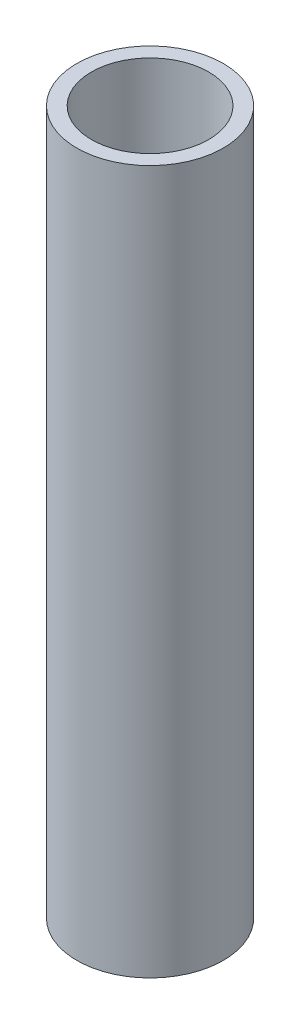
ISO-10303-21;
HEADER;
FILE_DESCRIPTION(('STEP AP214'),'2;1');
FILE_NAME('part.step','',(''),(''),'','','');
FILE_SCHEMA(('AUTOMOTIVE_DESIGN { 1 0 10303 214 1 1 1 1 }'));
ENDSEC;
DATA;
#1=APPLICATION_CONTEXT('core data for automotive mechanical design processes');
#2=APPLICATION_PROTOCOL_DEFINITION('international standard','automotive_design',2000,#1);
#3=PRODUCT_CONTEXT('',#1,'mechanical');
#4=PRODUCT('Part','Part','',(#3));
#5=PRODUCT_RELATED_PRODUCT_CATEGORY('part','',(#4));
#6=PRODUCT_DEFINITION_FORMATION('','',#4);
#7=PRODUCT_DEFINITION_CONTEXT('part definition',#1,'design');
#8=PRODUCT_DEFINITION('design','',#6,#7);
#9=PRODUCT_DEFINITION_SHAPE('','',#8);
#10=(LENGTH_UNIT() NAMED_UNIT(*) SI_UNIT(.MILLI.,.METRE.));
#11=(NAMED_UNIT(*) PLANE_ANGLE_UNIT() SI_UNIT($,.RADIAN.));
#12=(NAMED_UNIT(*) SI_UNIT($,.STERADIAN.) SOLID_ANGLE_UNIT());
#13=UNCERTAINTY_MEASURE_WITH_UNIT(LENGTH_MEASURE(1.E-05),#10,'distance_accuracy_value','');
#14=(GEOMETRIC_REPRESENTATION_CONTEXT(3) GLOBAL_UNCERTAINTY_ASSIGNED_CONTEXT((#13)) GLOBAL_UNIT_ASSIGNED_CONTEXT((#10,
#11,#12)) REPRESENTATION_CONTEXT('',''));
#15=CARTESIAN_POINT('',(0.,0.,0.));
#16=DIRECTION('',(0.,0.,1.));
#17=DIRECTION('',(1.,0.,0.));
#18=AXIS2_PLACEMENT_3D('',#15,#16,#17);
#19=CARTESIAN_POINT('',(0.,76.2,0.));
#20=DIRECTION('',(0.,1.,0.));
#21=DIRECTION('',(0.,0.,1.));
#22=AXIS2_PLACEMENT_3D('',#19,#20,#21);
#23=PLANE('',#22);
#24=CARTESIAN_POINT('',(0.,76.2,0.));
#25=DIRECTION('',(0.,1.,0.));
#26=DIRECTION('',(0.,0.,1.));
#27=AXIS2_PLACEMENT_3D('',#24,#25,#26);
#28=CIRCLE('',#27,7.9375);
#29=CARTESIAN_POINT('',(0.,76.2,-7.9375));
#30=VERTEX_POINT('',#29);
#31=EDGE_CURVE('E10',#30,#30,#28,.T.);
#32=ORIENTED_EDGE('',*,*,#31,.T.);
#33=EDGE_LOOP('',(#32));
#34=FACE_BOUND('',#33,.T.);
#35=CARTESIAN_POINT('',(0.,76.2,0.));
#36=DIRECTION('',(0.,1.,0.));
#37=DIRECTION('',(0.,0.,1.));
#38=AXIS2_PLACEMENT_3D('',#35,#36,#37);
#39=CIRCLE('',#38,6.35);
#40=CARTESIAN_POINT('',(0.,76.2,-6.35));
#41=VERTEX_POINT('',#40);
#42=EDGE_CURVE('E43',#41,#41,#39,.T.);
#43=ORIENTED_EDGE('',*,*,#42,.F.);
#44=EDGE_LOOP('',(#43));
#45=FACE_BOUND('',#44,.T.);
#46=ADVANCED_FACE('F32',(#34,#45),#23,.T.);
#47=CARTESIAN_POINT('',(0.,0.,0.));
#48=DIRECTION('',(0.,1.,0.));
#49=DIRECTION('',(0.,0.,1.));
#50=AXIS2_PLACEMENT_3D('',#47,#48,#49);
#51=PLANE('',#50);
#52=CARTESIAN_POINT('',(0.,0.,0.));
#53=DIRECTION('',(0.,1.,0.));
#54=DIRECTION('',(0.,0.,1.));
#55=AXIS2_PLACEMENT_3D('',#52,#53,#54);
#56=CIRCLE('',#55,7.9375);
#57=CARTESIAN_POINT('',(0.,0.,-7.9375));
#58=VERTEX_POINT('',#57);
#59=EDGE_CURVE('E36',#58,#58,#56,.T.);
#60=ORIENTED_EDGE('',*,*,#59,.F.);
#61=EDGE_LOOP('',(#60));
#62=FACE_BOUND('',#61,.T.);
#63=CARTESIAN_POINT('',(0.,0.,0.));
#64=DIRECTION('',(0.,1.,0.));
#65=DIRECTION('',(0.,0.,1.));
#66=AXIS2_PLACEMENT_3D('',#63,#64,#65);
#67=CIRCLE('',#66,6.35);
#68=CARTESIAN_POINT('',(0.,0.,-6.35));
#69=VERTEX_POINT('',#68);
#70=EDGE_CURVE('E45',#69,#69,#67,.T.);
#71=ORIENTED_EDGE('',*,*,#70,.T.);
#72=EDGE_LOOP('',(#71));
#73=FACE_BOUND('',#72,.T.);
#74=ADVANCED_FACE('F55',(#62,#73),#51,.F.);
#75=CARTESIAN_POINT('',(0.,76.2,0.));
#76=DIRECTION('',(0.,-1.,0.));
#77=DIRECTION('',(0.,0.,-1.));
#78=AXIS2_PLACEMENT_3D('',#75,#76,#77);
#79=CYLINDRICAL_SURFACE('',#78,7.9375);
#80=CARTESIAN_POINT('',(0.,76.2,-7.9375));
#81=CARTESIAN_POINT('',(0.,75.40625,-7.9375));
#82=CARTESIAN_POINT('',(0.,74.6125,-7.9375));
#83=CARTESIAN_POINT('',(0.,73.025,-7.9375));
#84=CARTESIAN_POINT('',(0.,72.23125,-7.9375));
#85=CARTESIAN_POINT('',(0.,70.64375,-7.9375));
#86=CARTESIAN_POINT('',(0.,69.85,-7.9375));
#87=CARTESIAN_POINT('',(0.,68.2625,-7.9375));
#88=CARTESIAN_POINT('',(0.,67.46875,-7.9375));
#89=CARTESIAN_POINT('',(0.,65.88125,-7.9375));
#90=CARTESIAN_POINT('',(0.,65.0875,-7.9375));
#91=CARTESIAN_POINT('',(0.,63.5,-7.9375));
#92=CARTESIAN_POINT('',(0.,62.70625,-7.9375));
#93=CARTESIAN_POINT('',(0.,61.11875,-7.9375));
#94=CARTESIAN_POINT('',(0.,60.325,-7.9375));
#95=CARTESIAN_POINT('',(0.,58.7375,-7.9375));
#96=CARTESIAN_POINT('',(0.,57.94375,-7.9375));
#97=CARTESIAN_POINT('',(0.,56.35625,-7.9375));
#98=CARTESIAN_POINT('',(0.,55.5625,-7.9375));
#99=CARTESIAN_POINT('',(0.,53.975,-7.9375));
#100=CARTESIAN_POINT('',(0.,53.18125,-7.9375));
#101=CARTESIAN_POINT('',(0.,51.59375,-7.9375));
#102=CARTESIAN_POINT('',(0.,50.8,-7.9375));
#103=CARTESIAN_POINT('',(0.,49.2125,-7.9375));
#104=CARTESIAN_POINT('',(0.,48.41875,-7.9375));
#105=CARTESIAN_POINT('',(0.,46.83125,-7.9375));
#106=CARTESIAN_POINT('',(0.,46.0375,-7.9375));
#107=CARTESIAN_POINT('',(0.,44.45,-7.9375));
#108=CARTESIAN_POINT('',(0.,43.65625,-7.9375));
#109=CARTESIAN_POINT('',(0.,42.06875,-7.9375));
#110=CARTESIAN_POINT('',(0.,41.275,-7.9375));
#111=CARTESIAN_POINT('',(0.,39.6875,-7.9375));
#112=CARTESIAN_POINT('',(0.,38.89375,-7.9375));
#113=CARTESIAN_POINT('',(0.,37.30625,-7.9375));
#114=CARTESIAN_POINT('',(0.,36.5125,-7.9375));
#115=CARTESIAN_POINT('',(0.,34.925,-7.9375));
#116=CARTESIAN_POINT('',(0.,34.13125,-7.9375));
#117=CARTESIAN_POINT('',(0.,32.54375,-7.9375));
#118=CARTESIAN_POINT('',(0.,31.75,-7.9375));
#119=CARTESIAN_POINT('',(0.,30.1625,-7.9375));
#120=CARTESIAN_POINT('',(0.,29.36875,-7.9375));
#121=CARTESIAN_POINT('',(0.,27.78125,-7.9375));
#122=CARTESIAN_POINT('',(0.,26.9875,-7.9375));
#123=CARTESIAN_POINT('',(0.,25.4,-7.9375));
#124=CARTESIAN_POINT('',(0.,24.60625,-7.9375));
#125=CARTESIAN_POINT('',(0.,23.01875,-7.9375));
#126=CARTESIAN_POINT('',(0.,22.225,-7.9375));
#127=CARTESIAN_POINT('',(0.,20.6375,-7.9375));
#128=CARTESIAN_POINT('',(0.,19.84375,-7.9375));
#129=CARTESIAN_POINT('',(0.,18.25625,-7.9375));
#130=CARTESIAN_POINT('',(0.,17.4625,-7.9375));
#131=CARTESIAN_POINT('',(0.,15.875,-7.9375));
#132=CARTESIAN_POINT('',(0.,15.08125,-7.9375));
#133=CARTESIAN_POINT('',(0.,13.49375,-7.9375));
#134=CARTESIAN_POINT('',(0.,12.7,-7.9375));
#135=CARTESIAN_POINT('',(0.,11.1125,-7.9375));
#136=CARTESIAN_POINT('',(0.,10.31875,-7.9375));
#137=CARTESIAN_POINT('',(0.,8.73125,-7.9375));
#138=CARTESIAN_POINT('',(0.,7.93750000000001,-7.9375));
#139=CARTESIAN_POINT('',(0.,6.35,-7.9375));
#140=CARTESIAN_POINT('',(0.,5.55625,-7.9375));
#141=CARTESIAN_POINT('',(0.,3.96875,-7.9375));
#142=CARTESIAN_POINT('',(0.,3.175,-7.9375));
#143=CARTESIAN_POINT('',(0.,1.5875,-7.9375));
#144=CARTESIAN_POINT('',(0.,0.793750000000001,-7.9375));
#145=CARTESIAN_POINT('',(0.,0.,-7.9375));
#146=B_SPLINE_CURVE_WITH_KNOTS('',3,(#80,#81,#82,#83,#84,#85,#86,#87,#88,#89,#90,#91,#92,#93,
#94,#95,#96,#97,#98,#99,#100,#101,#102,#103,#104,#105,#106,#107,#108,#109,#110,#111,#112,#113,
#114,#115,#116,#117,#118,#119,#120,#121,#122,#123,#124,#125,#126,#127,#128,#129,#130,#131,#132,
#133,#134,#135,#136,#137,#138,#139,#140,#141,#142,#143,#144,#145),.UNSPECIFIED.,.F.,.F.,(4,2,2,
2,2,2,2,2,2,2,2,2,2,2,2,2,2,2,2,2,2,2,2,2,2,2,2,2,2,2,2,2,4),(0.,2.38124999999999,
4.76249999999999,7.14374999999999,9.52499999999999,11.90625,14.2875,16.66875,19.05,21.43125,
23.8125,26.19375,28.575,30.95625,33.3375,35.71875,38.1,40.48125,42.8625,45.24375,47.625,
50.00625,52.3875,54.76875,57.15,59.53125,61.9125,64.29375,66.675,69.05625,71.4375,73.81875,
76.2),.UNSPECIFIED.);
#147=EDGE_CURVE('BSEAM34',#30,#58,#146,.T.);
#148=ORIENTED_EDGE('',*,*,#31,.F.);
#149=ORIENTED_EDGE('',*,*,#59,.T.);
#150=ORIENTED_EDGE('',*,*,#147,.T.);
#151=ORIENTED_EDGE('',*,*,#147,.F.);
#152=EDGE_LOOP('',(#148,#150,#149,#151));
#153=FACE_BOUND('',#152,.T.);
#154=ADVANCED_FACE('F34',(#153),#79,.T.);
#155=CARTESIAN_POINT('',(0.,76.2,0.));
#156=DIRECTION('',(0.,-1.,0.));
#157=DIRECTION('',(0.,0.,-1.));
#158=AXIS2_PLACEMENT_3D('',#155,#156,#157);
#159=CYLINDRICAL_SURFACE('',#158,6.35);
#160=CARTESIAN_POINT('',(0.,76.2,-6.35));
#161=CARTESIAN_POINT('',(0.,75.40625,-6.35));
#162=CARTESIAN_POINT('',(0.,74.6125,-6.35));
#163=CARTESIAN_POINT('',(0.,73.025,-6.35));
#164=CARTESIAN_POINT('',(0.,72.23125,-6.35));
#165=CARTESIAN_POINT('',(0.,70.64375,-6.35));
#166=CARTESIAN_POINT('',(0.,69.85,-6.35));
#167=CARTESIAN_POINT('',(0.,68.2625,-6.35));
#168=CARTESIAN_POINT('',(0.,67.46875,-6.35));
#169=CARTESIAN_POINT('',(0.,65.88125,-6.35));
#170=CARTESIAN_POINT('',(0.,65.0875,-6.35));
#171=CARTESIAN_POINT('',(0.,63.5,-6.35));
#172=CARTESIAN_POINT('',(0.,62.70625,-6.35));
#173=CARTESIAN_POINT('',(0.,61.11875,-6.35));
#174=CARTESIAN_POINT('',(0.,60.325,-6.35));
#175=CARTESIAN_POINT('',(0.,58.7375,-6.35));
#176=CARTESIAN_POINT('',(0.,57.94375,-6.35));
#177=CARTESIAN_POINT('',(0.,56.35625,-6.35));
#178=CARTESIAN_POINT('',(0.,55.5625,-6.35));
#179=CARTESIAN_POINT('',(0.,53.975,-6.35));
#180=CARTESIAN_POINT('',(0.,53.18125,-6.35));
#181=CARTESIAN_POINT('',(0.,51.59375,-6.35));
#182=CARTESIAN_POINT('',(0.,50.8,-6.35));
#183=CARTESIAN_POINT('',(0.,49.2125,-6.35));
#184=CARTESIAN_POINT('',(0.,48.41875,-6.35));
#185=CARTESIAN_POINT('',(0.,46.83125,-6.35));
#186=CARTESIAN_POINT('',(0.,46.0375,-6.35));
#187=CARTESIAN_POINT('',(0.,44.45,-6.35));
#188=CARTESIAN_POINT('',(0.,43.65625,-6.35));
#189=CARTESIAN_POINT('',(0.,42.06875,-6.35));
#190=CARTESIAN_POINT('',(0.,41.275,-6.35));
#191=CARTESIAN_POINT('',(0.,39.6875,-6.35));
#192=CARTESIAN_POINT('',(0.,38.89375,-6.35));
#193=CARTESIAN_POINT('',(0.,37.30625,-6.35));
#194=CARTESIAN_POINT('',(0.,36.5125,-6.35));
#195=CARTESIAN_POINT('',(0.,34.925,-6.35));
#196=CARTESIAN_POINT('',(0.,34.13125,-6.35));
#197=CARTESIAN_POINT('',(0.,32.54375,-6.35));
#198=CARTESIAN_POINT('',(0.,31.75,-6.35));
#199=CARTESIAN_POINT('',(0.,30.1625,-6.35));
#200=CARTESIAN_POINT('',(0.,29.36875,-6.35));
#201=CARTESIAN_POINT('',(0.,27.78125,-6.35));
#202=CARTESIAN_POINT('',(0.,26.9875,-6.35));
#203=CARTESIAN_POINT('',(0.,25.4,-6.35));
#204=CARTESIAN_POINT('',(0.,24.60625,-6.35));
#205=CARTESIAN_POINT('',(0.,23.01875,-6.35));
#206=CARTESIAN_POINT('',(0.,22.225,-6.35));
#207=CARTESIAN_POINT('',(0.,20.6375,-6.35));
#208=CARTESIAN_POINT('',(0.,19.84375,-6.35));
#209=CARTESIAN_POINT('',(0.,18.25625,-6.35));
#210=CARTESIAN_POINT('',(0.,17.4625,-6.35));
#211=CARTESIAN_POINT('',(0.,15.875,-6.35));
#212=CARTESIAN_POINT('',(0.,15.08125,-6.35));
#213=CARTESIAN_POINT('',(0.,13.49375,-6.35));
#214=CARTESIAN_POINT('',(0.,12.7,-6.35));
#215=CARTESIAN_POINT('',(0.,11.1125,-6.35));
#216=CARTESIAN_POINT('',(0.,10.31875,-6.35));
#217=CARTESIAN_POINT('',(0.,8.73125,-6.35));
#218=CARTESIAN_POINT('',(0.,7.93750000000001,-6.35));
#219=CARTESIAN_POINT('',(0.,6.35,-6.35));
#220=CARTESIAN_POINT('',(0.,5.55625,-6.35));
#221=CARTESIAN_POINT('',(0.,3.96875,-6.35));
#222=CARTESIAN_POINT('',(0.,3.175,-6.35));
#223=CARTESIAN_POINT('',(0.,1.5875,-6.35));
#224=CARTESIAN_POINT('',(0.,0.793750000000001,-6.35));
#225=CARTESIAN_POINT('',(0.,0.,-6.35));
#226=B_SPLINE_CURVE_WITH_KNOTS('',3,(#160,#161,#162,#163,#164,#165,#166,#167,#168,#169,#170,
#171,#172,#173,#174,#175,#176,#177,#178,#179,#180,#181,#182,#183,#184,#185,#186,#187,#188,#189,
#190,#191,#192,#193,#194,#195,#196,#197,#198,#199,#200,#201,#202,#203,#204,#205,#206,#207,#208,
#209,#210,#211,#212,#213,#214,#215,#216,#217,#218,#219,#220,#221,#222,#223,#224,#225),
.UNSPECIFIED.,.F.,.F.,(4,2,2,2,2,2,2,2,2,2,2,2,2,2,2,2,2,2,2,2,2,2,2,2,2,2,2,2,2,2,2,2,4),(0.,
2.38124999999999,4.76249999999999,7.14374999999999,9.52499999999999,11.90625,14.2875,16.66875,
19.05,21.43125,23.8125,26.19375,28.575,30.95625,33.3375,35.71875,38.1,40.48125,42.8625,45.24375,
47.625,50.00625,52.3875,54.76875,57.15,59.53125,61.9125,64.29375,66.675,69.05625,71.4375,
73.81875,76.2),.UNSPECIFIED.);
#227=EDGE_CURVE('BSEAM51',#41,#69,#226,.T.);
#228=ORIENTED_EDGE('',*,*,#42,.T.);
#229=ORIENTED_EDGE('',*,*,#70,.F.);
#230=ORIENTED_EDGE('',*,*,#227,.T.);
#231=ORIENTED_EDGE('',*,*,#227,.F.);
#232=EDGE_LOOP('',(#228,#230,#229,#231));
#233=FACE_BOUND('',#232,.T.);
#234=ADVANCED_FACE('F51',(#233),#159,.F.);
#235=CLOSED_SHELL('',(#46,#74,#154,#234));
#236=MANIFOLD_SOLID_BREP('B2',#235);
#237=ADVANCED_BREP_SHAPE_REPRESENTATION('',(#18,#236),#14);
#238=SHAPE_DEFINITION_REPRESENTATION(#9,#237);
ENDSEC;
END-ISO-10303-21;
